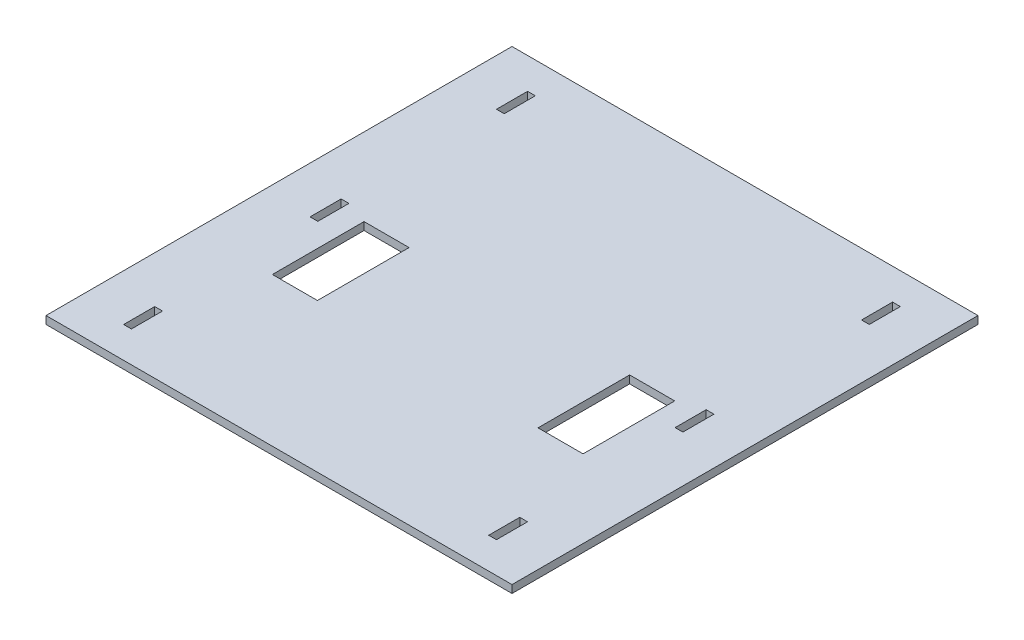
ISO-10303-21;
HEADER;
FILE_DESCRIPTION(('STEP AP214'),'2;1');
FILE_NAME('part.step','',(''),(''),'','','');
FILE_SCHEMA(('AUTOMOTIVE_DESIGN { 1 0 10303 214 1 1 1 1 }'));
ENDSEC;
DATA;
#1=APPLICATION_CONTEXT('core data for automotive mechanical design processes');
#2=APPLICATION_PROTOCOL_DEFINITION('international standard','automotive_design',2000,#1);
#3=PRODUCT_CONTEXT('',#1,'mechanical');
#4=PRODUCT('Part','Part','',(#3));
#5=PRODUCT_RELATED_PRODUCT_CATEGORY('part','',(#4));
#6=PRODUCT_DEFINITION_FORMATION('','',#4);
#7=PRODUCT_DEFINITION_CONTEXT('part definition',#1,'design');
#8=PRODUCT_DEFINITION('design','',#6,#7);
#9=PRODUCT_DEFINITION_SHAPE('','',#8);
#10=(LENGTH_UNIT() NAMED_UNIT(*) SI_UNIT(.MILLI.,.METRE.));
#11=(NAMED_UNIT(*) PLANE_ANGLE_UNIT() SI_UNIT($,.RADIAN.));
#12=(NAMED_UNIT(*) SI_UNIT($,.STERADIAN.) SOLID_ANGLE_UNIT());
#13=UNCERTAINTY_MEASURE_WITH_UNIT(LENGTH_MEASURE(1.E-05),#10,'distance_accuracy_value','');
#14=(GEOMETRIC_REPRESENTATION_CONTEXT(3) GLOBAL_UNCERTAINTY_ASSIGNED_CONTEXT((#13)) GLOBAL_UNIT_ASSIGNED_CONTEXT((#10,
#11,#12)) REPRESENTATION_CONTEXT('',''));
#15=CARTESIAN_POINT('',(0.,0.,0.));
#16=DIRECTION('',(0.,0.,1.));
#17=DIRECTION('',(1.,0.,0.));
#18=AXIS2_PLACEMENT_3D('',#15,#16,#17);
#19=CARTESIAN_POINT('',(0.,5.,0.));
#20=DIRECTION('',(1.,0.,0.));
#21=DIRECTION('',(0.,0.,-1.));
#22=AXIS2_PLACEMENT_3D('',#19,#20,#21);
#23=PLANE('',#22);
#24=DIRECTION('',(0.,0.,1.));
#25=VECTOR('',#24,1.);
#26=CARTESIAN_POINT('',(0.,0.,0.));
#27=LINE('',#26,#25);
#28=CARTESIAN_POINT('',(0.,0.,-300.));
#29=VERTEX_POINT('',#28);
#30=CARTESIAN_POINT('',(0.,0.,0.));
#31=VERTEX_POINT('',#30);
#32=EDGE_CURVE('E579',#29,#31,#27,.T.);
#33=ORIENTED_EDGE('',*,*,#32,.T.);
#34=DIRECTION('',(0.,-1.,0.));
#35=VECTOR('',#34,1.);
#36=CARTESIAN_POINT('',(0.,5.,0.));
#37=LINE('',#36,#35);
#38=CARTESIAN_POINT('',(0.,5.,0.));
#39=VERTEX_POINT('',#38);
#40=EDGE_CURVE('E11',#39,#31,#37,.T.);
#41=ORIENTED_EDGE('',*,*,#40,.F.);
#42=DIRECTION('',(0.,0.,1.));
#43=VECTOR('',#42,1.);
#44=CARTESIAN_POINT('',(0.,5.,0.));
#45=LINE('',#44,#43);
#46=CARTESIAN_POINT('',(0.,5.,-300.));
#47=VERTEX_POINT('',#46);
#48=EDGE_CURVE('E631',#47,#39,#45,.T.);
#49=ORIENTED_EDGE('',*,*,#48,.F.);
#50=DIRECTION('',(0.,-1.,0.));
#51=VECTOR('',#50,1.);
#52=CARTESIAN_POINT('',(0.,5.,-300.));
#53=LINE('',#52,#51);
#54=EDGE_CURVE('E645',#47,#29,#53,.T.);
#55=ORIENTED_EDGE('',*,*,#54,.T.);
#56=EDGE_LOOP('',(#33,#41,#49,#55));
#57=FACE_BOUND('',#56,.T.);
#58=ADVANCED_FACE('F38',(#57),#23,.F.);
#59=CARTESIAN_POINT('',(0.,5.,0.));
#60=DIRECTION('',(0.,0.,-1.));
#61=DIRECTION('',(-1.,0.,0.));
#62=AXIS2_PLACEMENT_3D('',#59,#60,#61);
#63=PLANE('',#62);
#64=DIRECTION('',(1.,0.,0.));
#65=VECTOR('',#64,1.);
#66=CARTESIAN_POINT('',(0.,0.,0.));
#67=LINE('',#66,#65);
#68=CARTESIAN_POINT('',(300.,0.,0.));
#69=VERTEX_POINT('',#68);
#70=EDGE_CURVE('E649',#31,#69,#67,.T.);
#71=ORIENTED_EDGE('',*,*,#70,.T.);
#72=DIRECTION('',(0.,-1.,0.));
#73=VECTOR('',#72,1.);
#74=CARTESIAN_POINT('',(300.,5.,0.));
#75=LINE('',#74,#73);
#76=CARTESIAN_POINT('',(300.,5.,0.));
#77=VERTEX_POINT('',#76);
#78=EDGE_CURVE('E46',#77,#69,#75,.T.);
#79=ORIENTED_EDGE('',*,*,#78,.F.);
#80=DIRECTION('',(1.,0.,0.));
#81=VECTOR('',#80,1.);
#82=CARTESIAN_POINT('',(0.,5.,0.));
#83=LINE('',#82,#81);
#84=EDGE_CURVE('E635',#39,#77,#83,.T.);
#85=ORIENTED_EDGE('',*,*,#84,.F.);
#86=ORIENTED_EDGE('',*,*,#40,.T.);
#87=EDGE_LOOP('',(#71,#79,#85,#86));
#88=FACE_BOUND('',#87,.T.);
#89=ADVANCED_FACE('F684',(#88),#63,.F.);
#90=CARTESIAN_POINT('',(300.,5.,0.));
#91=DIRECTION('',(-1.,0.,0.));
#92=DIRECTION('',(0.,0.,1.));
#93=AXIS2_PLACEMENT_3D('',#90,#91,#92);
#94=PLANE('',#93);
#95=DIRECTION('',(0.,0.,-1.));
#96=VECTOR('',#95,1.);
#97=CARTESIAN_POINT('',(300.,0.,0.));
#98=LINE('',#97,#96);
#99=CARTESIAN_POINT('',(300.,0.,-300.));
#100=VERTEX_POINT('',#99);
#101=EDGE_CURVE('E652',#69,#100,#98,.T.);
#102=ORIENTED_EDGE('',*,*,#101,.T.);
#103=DIRECTION('',(0.,-1.,0.));
#104=VECTOR('',#103,1.);
#105=CARTESIAN_POINT('',(300.,5.,-300.));
#106=LINE('',#105,#104);
#107=CARTESIAN_POINT('',(300.,5.,-300.));
#108=VERTEX_POINT('',#107);
#109=EDGE_CURVE('E660',#108,#100,#106,.T.);
#110=ORIENTED_EDGE('',*,*,#109,.F.);
#111=DIRECTION('',(0.,0.,-1.));
#112=VECTOR('',#111,1.);
#113=CARTESIAN_POINT('',(300.,5.,0.));
#114=LINE('',#113,#112);
#115=EDGE_CURVE('E639',#77,#108,#114,.T.);
#116=ORIENTED_EDGE('',*,*,#115,.F.);
#117=ORIENTED_EDGE('',*,*,#78,.T.);
#118=EDGE_LOOP('',(#102,#110,#116,#117));
#119=FACE_BOUND('',#118,.T.);
#120=ADVANCED_FACE('F669',(#119),#94,.F.);
#121=CARTESIAN_POINT('',(0.,5.,-300.));
#122=DIRECTION('',(0.,0.,1.));
#123=DIRECTION('',(1.,0.,0.));
#124=AXIS2_PLACEMENT_3D('',#121,#122,#123);
#125=PLANE('',#124);
#126=DIRECTION('',(-1.,0.,0.));
#127=VECTOR('',#126,1.);
#128=CARTESIAN_POINT('',(0.,0.,-300.));
#129=LINE('',#128,#127);
#130=EDGE_CURVE('E636',#100,#29,#129,.T.);
#131=ORIENTED_EDGE('',*,*,#130,.T.);
#132=ORIENTED_EDGE('',*,*,#54,.F.);
#133=DIRECTION('',(-1.,0.,0.));
#134=VECTOR('',#133,1.);
#135=CARTESIAN_POINT('',(0.,5.,-300.));
#136=LINE('',#135,#134);
#137=EDGE_CURVE('E642',#108,#47,#136,.T.);
#138=ORIENTED_EDGE('',*,*,#137,.F.);
#139=ORIENTED_EDGE('',*,*,#109,.T.);
#140=EDGE_LOOP('',(#131,#132,#138,#139));
#141=FACE_BOUND('',#140,.T.);
#142=ADVANCED_FACE('F677',(#141),#125,.F.);
#143=CARTESIAN_POINT('',(0.,5.,0.));
#144=DIRECTION('',(0.,-1.,0.));
#145=DIRECTION('',(0.,0.,-1.));
#146=AXIS2_PLACEMENT_3D('',#143,#144,#145);
#147=PLANE('',#146);
#148=DIRECTION('',(-1.,0.,0.));
#149=VECTOR('',#148,1.);
#150=CARTESIAN_POINT('',(270.,5.,-160.));
#151=LINE('',#150,#149);
#152=CARTESIAN_POINT('',(270.,5.,-160.));
#153=VERTEX_POINT('',#152);
#154=CARTESIAN_POINT('',(265.,5.,-160.));
#155=VERTEX_POINT('',#154);
#156=EDGE_CURVE('E347',#153,#155,#151,.T.);
#157=ORIENTED_EDGE('',*,*,#156,.F.);
#158=DIRECTION('',(0.,0.,-1.));
#159=VECTOR('',#158,1.);
#160=CARTESIAN_POINT('',(270.,5.,-140.));
#161=LINE('',#160,#159);
#162=CARTESIAN_POINT('',(270.,5.,-140.));
#163=VERTEX_POINT('',#162);
#164=EDGE_CURVE('E53',#163,#153,#161,.T.);
#165=ORIENTED_EDGE('',*,*,#164,.F.);
#166=DIRECTION('',(1.,0.,0.));
#167=VECTOR('',#166,1.);
#168=CARTESIAN_POINT('',(270.,5.,-140.));
#169=LINE('',#168,#167);
#170=CARTESIAN_POINT('',(265.,5.,-140.));
#171=VERTEX_POINT('',#170);
#172=EDGE_CURVE('E332',#171,#163,#169,.T.);
#173=ORIENTED_EDGE('',*,*,#172,.F.);
#174=DIRECTION('',(0.,0.,1.));
#175=VECTOR('',#174,1.);
#176=CARTESIAN_POINT('',(265.,5.,-140.));
#177=LINE('',#176,#175);
#178=EDGE_CURVE('E352',#155,#171,#177,.T.);
#179=ORIENTED_EDGE('',*,*,#178,.F.);
#180=EDGE_LOOP('',(#157,#165,#173,#179));
#181=FACE_BOUND('',#180,.T.);
#182=DIRECTION('',(-1.,0.,0.));
#183=VECTOR('',#182,1.);
#184=CARTESIAN_POINT('',(270.,5.,-280.));
#185=LINE('',#184,#183);
#186=CARTESIAN_POINT('',(270.,5.,-280.));
#187=VERTEX_POINT('',#186);
#188=CARTESIAN_POINT('',(265.,5.,-280.));
#189=VERTEX_POINT('',#188);
#190=EDGE_CURVE('E391',#187,#189,#185,.T.);
#191=ORIENTED_EDGE('',*,*,#190,.F.);
#192=DIRECTION('',(0.,0.,-1.));
#193=VECTOR('',#192,1.);
#194=CARTESIAN_POINT('',(270.,5.,-260.));
#195=LINE('',#194,#193);
#196=CARTESIAN_POINT('',(270.,5.,-260.));
#197=VERTEX_POINT('',#196);
#198=EDGE_CURVE('E61',#197,#187,#195,.T.);
#199=ORIENTED_EDGE('',*,*,#198,.F.);
#200=DIRECTION('',(1.,0.,0.));
#201=VECTOR('',#200,1.);
#202=CARTESIAN_POINT('',(270.,5.,-260.));
#203=LINE('',#202,#201);
#204=CARTESIAN_POINT('',(265.,5.,-260.));
#205=VERTEX_POINT('',#204);
#206=EDGE_CURVE('E376',#205,#197,#203,.T.);
#207=ORIENTED_EDGE('',*,*,#206,.F.);
#208=DIRECTION('',(0.,0.,1.));
#209=VECTOR('',#208,1.);
#210=CARTESIAN_POINT('',(265.,5.,-260.));
#211=LINE('',#210,#209);
#212=EDGE_CURVE('E396',#189,#205,#211,.T.);
#213=ORIENTED_EDGE('',*,*,#212,.F.);
#214=EDGE_LOOP('',(#191,#199,#207,#213));
#215=FACE_BOUND('',#214,.T.);
#216=DIRECTION('',(-1.,0.,0.));
#217=VECTOR('',#216,1.);
#218=CARTESIAN_POINT('',(35.,5.,-40.));
#219=LINE('',#218,#217);
#220=CARTESIAN_POINT('',(35.,5.,-40.));
#221=VERTEX_POINT('',#220);
#222=CARTESIAN_POINT('',(30.,5.,-40.));
#223=VERTEX_POINT('',#222);
#224=EDGE_CURVE('E434',#221,#223,#219,.T.);
#225=ORIENTED_EDGE('',*,*,#224,.F.);
#226=DIRECTION('',(0.,0.,-1.));
#227=VECTOR('',#226,1.);
#228=CARTESIAN_POINT('',(35.,5.,-20.));
#229=LINE('',#228,#227);
#230=CARTESIAN_POINT('',(35.,5.,-20.));
#231=VERTEX_POINT('',#230);
#232=EDGE_CURVE('E431',#231,#221,#229,.T.);
#233=ORIENTED_EDGE('',*,*,#232,.F.);
#234=DIRECTION('',(1.,0.,0.));
#235=VECTOR('',#234,1.);
#236=CARTESIAN_POINT('',(35.,5.,-20.));
#237=LINE('',#236,#235);
#238=CARTESIAN_POINT('',(30.,5.,-20.));
#239=VERTEX_POINT('',#238);
#240=EDGE_CURVE('E418',#239,#231,#237,.T.);
#241=ORIENTED_EDGE('',*,*,#240,.F.);
#242=DIRECTION('',(0.,0.,1.));
#243=VECTOR('',#242,1.);
#244=CARTESIAN_POINT('',(30.,5.,-20.));
#245=LINE('',#244,#243);
#246=EDGE_CURVE('E439',#223,#239,#245,.T.);
#247=ORIENTED_EDGE('',*,*,#246,.F.);
#248=EDGE_LOOP('',(#225,#233,#241,#247));
#249=FACE_BOUND('',#248,.T.);
#250=DIRECTION('',(-1.,0.,0.));
#251=VECTOR('',#250,1.);
#252=CARTESIAN_POINT('',(35.,5.,-160.));
#253=LINE('',#252,#251);
#254=CARTESIAN_POINT('',(35.,5.,-160.));
#255=VERTEX_POINT('',#254);
#256=CARTESIAN_POINT('',(30.,5.,-160.));
#257=VERTEX_POINT('',#256);
#258=EDGE_CURVE('E477',#255,#257,#253,.T.);
#259=ORIENTED_EDGE('',*,*,#258,.F.);
#260=DIRECTION('',(0.,0.,-1.));
#261=VECTOR('',#260,1.);
#262=CARTESIAN_POINT('',(35.,5.,-140.));
#263=LINE('',#262,#261);
#264=CARTESIAN_POINT('',(35.,5.,-140.));
#265=VERTEX_POINT('',#264);
#266=EDGE_CURVE('E321',#265,#255,#263,.T.);
#267=ORIENTED_EDGE('',*,*,#266,.F.);
#268=DIRECTION('',(1.,0.,0.));
#269=VECTOR('',#268,1.);
#270=CARTESIAN_POINT('',(35.,5.,-140.));
#271=LINE('',#270,#269);
#272=CARTESIAN_POINT('',(30.,5.,-140.));
#273=VERTEX_POINT('',#272);
#274=EDGE_CURVE('E462',#273,#265,#271,.T.);
#275=ORIENTED_EDGE('',*,*,#274,.F.);
#276=DIRECTION('',(0.,0.,1.));
#277=VECTOR('',#276,1.);
#278=CARTESIAN_POINT('',(30.,5.,-140.));
#279=LINE('',#278,#277);
#280=EDGE_CURVE('E481',#257,#273,#279,.T.);
#281=ORIENTED_EDGE('',*,*,#280,.F.);
#282=EDGE_LOOP('',(#259,#267,#275,#281));
#283=FACE_BOUND('',#282,.T.);
#284=DIRECTION('',(-1.,0.,0.));
#285=VECTOR('',#284,1.);
#286=CARTESIAN_POINT('',(35.,5.,-280.));
#287=LINE('',#286,#285);
#288=CARTESIAN_POINT('',(35.,5.,-280.));
#289=VERTEX_POINT('',#288);
#290=CARTESIAN_POINT('',(30.,5.,-280.));
#291=VERTEX_POINT('',#290);
#292=EDGE_CURVE('E312',#289,#291,#287,.T.);
#293=ORIENTED_EDGE('',*,*,#292,.F.);
#294=DIRECTION('',(0.,0.,-1.));
#295=VECTOR('',#294,1.);
#296=CARTESIAN_POINT('',(35.,5.,-260.));
#297=LINE('',#296,#295);
#298=CARTESIAN_POINT('',(35.,5.,-260.));
#299=VERTEX_POINT('',#298);
#300=EDGE_CURVE('E278',#299,#289,#297,.T.);
#301=ORIENTED_EDGE('',*,*,#300,.F.);
#302=DIRECTION('',(1.,0.,0.));
#303=VECTOR('',#302,1.);
#304=CARTESIAN_POINT('',(35.,5.,-260.));
#305=LINE('',#304,#303);
#306=CARTESIAN_POINT('',(30.,5.,-260.));
#307=VERTEX_POINT('',#306);
#308=EDGE_CURVE('E299',#307,#299,#305,.T.);
#309=ORIENTED_EDGE('',*,*,#308,.F.);
#310=DIRECTION('',(0.,0.,1.));
#311=VECTOR('',#310,1.);
#312=CARTESIAN_POINT('',(30.,5.,-260.));
#313=LINE('',#312,#311);
#314=EDGE_CURVE('E303',#291,#307,#313,.T.);
#315=ORIENTED_EDGE('',*,*,#314,.F.);
#316=EDGE_LOOP('',(#293,#301,#309,#315));
#317=FACE_BOUND('',#316,.T.);
#318=DIRECTION('',(-1.,0.,0.));
#319=VECTOR('',#318,1.);
#320=CARTESIAN_POINT('',(270.,5.,-40.));
#321=LINE('',#320,#319);
#322=CARTESIAN_POINT('',(270.,5.,-40.));
#323=VERTEX_POINT('',#322);
#324=CARTESIAN_POINT('',(265.,5.,-40.));
#325=VERTEX_POINT('',#324);
#326=EDGE_CURVE('E519',#323,#325,#321,.T.);
#327=ORIENTED_EDGE('',*,*,#326,.F.);
#328=DIRECTION('',(0.,0.,-1.));
#329=VECTOR('',#328,1.);
#330=CARTESIAN_POINT('',(270.,5.,-20.));
#331=LINE('',#330,#329);
#332=CARTESIAN_POINT('',(270.,5.,-20.));
#333=VERTEX_POINT('',#332);
#334=EDGE_CURVE('E362',#333,#323,#331,.T.);
#335=ORIENTED_EDGE('',*,*,#334,.F.);
#336=DIRECTION('',(1.,0.,0.));
#337=VECTOR('',#336,1.);
#338=CARTESIAN_POINT('',(270.,5.,-20.));
#339=LINE('',#338,#337);
#340=CARTESIAN_POINT('',(265.,5.,-20.));
#341=VERTEX_POINT('',#340);
#342=EDGE_CURVE('E504',#341,#333,#339,.T.);
#343=ORIENTED_EDGE('',*,*,#342,.F.);
#344=DIRECTION('',(0.,0.,1.));
#345=VECTOR('',#344,1.);
#346=CARTESIAN_POINT('',(265.,5.,-20.));
#347=LINE('',#346,#345);
#348=EDGE_CURVE('E523',#325,#341,#347,.T.);
#349=ORIENTED_EDGE('',*,*,#348,.F.);
#350=EDGE_LOOP('',(#327,#335,#343,#349));
#351=FACE_BOUND('',#350,.T.);
#352=DIRECTION('',(-1.,0.,0.));
#353=VECTOR('',#352,1.);
#354=CARTESIAN_POINT('',(250.,5.,-154.75));
#355=LINE('',#354,#353);
#356=CARTESIAN_POINT('',(250.,5.,-154.75));
#357=VERTEX_POINT('',#356);
#358=CARTESIAN_POINT('',(221.,5.,-154.75));
#359=VERTEX_POINT('',#358);
#360=EDGE_CURVE('E564',#357,#359,#355,.T.);
#361=ORIENTED_EDGE('',*,*,#360,.F.);
#362=DIRECTION('',(0.,0.,-1.));
#363=VECTOR('',#362,1.);
#364=CARTESIAN_POINT('',(250.,5.,-95.7499999999999));
#365=LINE('',#364,#363);
#366=CARTESIAN_POINT('',(250.,5.,-95.7499999999999));
#367=VERTEX_POINT('',#366);
#368=EDGE_CURVE('E561',#367,#357,#365,.T.);
#369=ORIENTED_EDGE('',*,*,#368,.F.);
#370=DIRECTION('',(1.,0.,0.));
#371=VECTOR('',#370,1.);
#372=CARTESIAN_POINT('',(250.,5.,-95.7499999999999));
#373=LINE('',#372,#371);
#374=CARTESIAN_POINT('',(221.,5.,-95.7499999999999));
#375=VERTEX_POINT('',#374);
#376=EDGE_CURVE('E548',#375,#367,#373,.T.);
#377=ORIENTED_EDGE('',*,*,#376,.F.);
#378=DIRECTION('',(0.,0.,1.));
#379=VECTOR('',#378,1.);
#380=CARTESIAN_POINT('',(221.,5.,-95.7499999999999));
#381=LINE('',#380,#379);
#382=EDGE_CURVE('E569',#359,#375,#381,.T.);
#383=ORIENTED_EDGE('',*,*,#382,.F.);
#384=EDGE_LOOP('',(#361,#369,#377,#383));
#385=FACE_BOUND('',#384,.T.);
#386=DIRECTION('',(-1.,0.,0.));
#387=VECTOR('',#386,1.);
#388=CARTESIAN_POINT('',(79.,5.,-154.75));
#389=LINE('',#388,#387);
#390=CARTESIAN_POINT('',(79.,5.,-154.75));
#391=VERTEX_POINT('',#390);
#392=CARTESIAN_POINT('',(50.,5.,-154.75));
#393=VERTEX_POINT('',#392);
#394=EDGE_CURVE('E609',#391,#393,#389,.T.);
#395=ORIENTED_EDGE('',*,*,#394,.F.);
#396=DIRECTION('',(0.,0.,-1.));
#397=VECTOR('',#396,1.);
#398=CARTESIAN_POINT('',(79.,5.,-95.7499999999999));
#399=LINE('',#398,#397);
#400=CARTESIAN_POINT('',(79.,5.,-95.7499999999999));
#401=VERTEX_POINT('',#400);
#402=EDGE_CURVE('E533',#401,#391,#399,.T.);
#403=ORIENTED_EDGE('',*,*,#402,.F.);
#404=DIRECTION('',(1.,0.,0.));
#405=VECTOR('',#404,1.);
#406=CARTESIAN_POINT('',(79.,5.,-95.7499999999999));
#407=LINE('',#406,#405);
#408=CARTESIAN_POINT('',(50.,5.,-95.7499999999999));
#409=VERTEX_POINT('',#408);
#410=EDGE_CURVE('E594',#409,#401,#407,.T.);
#411=ORIENTED_EDGE('',*,*,#410,.F.);
#412=DIRECTION('',(0.,0.,1.));
#413=VECTOR('',#412,1.);
#414=CARTESIAN_POINT('',(50.,5.,-95.7499999999999));
#415=LINE('',#414,#413);
#416=EDGE_CURVE('E613',#393,#409,#415,.T.);
#417=ORIENTED_EDGE('',*,*,#416,.F.);
#418=EDGE_LOOP('',(#395,#403,#411,#417));
#419=FACE_BOUND('',#418,.T.);
#420=ORIENTED_EDGE('',*,*,#48,.T.);
#421=ORIENTED_EDGE('',*,*,#84,.T.);
#422=ORIENTED_EDGE('',*,*,#115,.T.);
#423=ORIENTED_EDGE('',*,*,#137,.T.);
#424=EDGE_LOOP('',(#420,#421,#422,#423));
#425=FACE_BOUND('',#424,.T.);
#426=ADVANCED_FACE('F683',(#181,#215,#249,#283,#317,#351,#385,#419,#425),#147,.F.);
#427=CARTESIAN_POINT('',(0.,0.,0.));
#428=DIRECTION('',(0.,-1.,0.));
#429=DIRECTION('',(0.,0.,-1.));
#430=AXIS2_PLACEMENT_3D('',#427,#428,#429);
#431=PLANE('',#430);
#432=DIRECTION('',(0.,0.,-1.));
#433=VECTOR('',#432,1.);
#434=CARTESIAN_POINT('',(270.,0.,-140.));
#435=LINE('',#434,#433);
#436=CARTESIAN_POINT('',(270.,0.,-140.));
#437=VERTEX_POINT('',#436);
#438=CARTESIAN_POINT('',(270.,0.,-160.));
#439=VERTEX_POINT('',#438);
#440=EDGE_CURVE('E327',#437,#439,#435,.T.);
#441=ORIENTED_EDGE('',*,*,#440,.T.);
#442=DIRECTION('',(-1.,0.,0.));
#443=VECTOR('',#442,1.);
#444=CARTESIAN_POINT('',(270.,0.,-160.));
#445=LINE('',#444,#443);
#446=CARTESIAN_POINT('',(265.,0.,-160.));
#447=VERTEX_POINT('',#446);
#448=EDGE_CURVE('E331',#439,#447,#445,.T.);
#449=ORIENTED_EDGE('',*,*,#448,.T.);
#450=DIRECTION('',(0.,0.,1.));
#451=VECTOR('',#450,1.);
#452=CARTESIAN_POINT('',(265.,0.,-140.));
#453=LINE('',#452,#451);
#454=CARTESIAN_POINT('',(265.,0.,-140.));
#455=VERTEX_POINT('',#454);
#456=EDGE_CURVE('E336',#447,#455,#453,.T.);
#457=ORIENTED_EDGE('',*,*,#456,.T.);
#458=DIRECTION('',(1.,0.,0.));
#459=VECTOR('',#458,1.);
#460=CARTESIAN_POINT('',(270.,0.,-140.));
#461=LINE('',#460,#459);
#462=EDGE_CURVE('E340',#455,#437,#461,.T.);
#463=ORIENTED_EDGE('',*,*,#462,.T.);
#464=EDGE_LOOP('',(#441,#449,#457,#463));
#465=FACE_BOUND('',#464,.T.);
#466=DIRECTION('',(0.,0.,-1.));
#467=VECTOR('',#466,1.);
#468=CARTESIAN_POINT('',(270.,0.,-260.));
#469=LINE('',#468,#467);
#470=CARTESIAN_POINT('',(270.,0.,-260.));
#471=VERTEX_POINT('',#470);
#472=CARTESIAN_POINT('',(270.,0.,-280.));
#473=VERTEX_POINT('',#472);
#474=EDGE_CURVE('E371',#471,#473,#469,.T.);
#475=ORIENTED_EDGE('',*,*,#474,.T.);
#476=DIRECTION('',(-1.,0.,0.));
#477=VECTOR('',#476,1.);
#478=CARTESIAN_POINT('',(270.,0.,-280.));
#479=LINE('',#478,#477);
#480=CARTESIAN_POINT('',(265.,0.,-280.));
#481=VERTEX_POINT('',#480);
#482=EDGE_CURVE('E375',#473,#481,#479,.T.);
#483=ORIENTED_EDGE('',*,*,#482,.T.);
#484=DIRECTION('',(0.,0.,1.));
#485=VECTOR('',#484,1.);
#486=CARTESIAN_POINT('',(265.,0.,-260.));
#487=LINE('',#486,#485);
#488=CARTESIAN_POINT('',(265.,0.,-260.));
#489=VERTEX_POINT('',#488);
#490=EDGE_CURVE('E380',#481,#489,#487,.T.);
#491=ORIENTED_EDGE('',*,*,#490,.T.);
#492=DIRECTION('',(1.,0.,0.));
#493=VECTOR('',#492,1.);
#494=CARTESIAN_POINT('',(270.,0.,-260.));
#495=LINE('',#494,#493);
#496=EDGE_CURVE('E384',#489,#471,#495,.T.);
#497=ORIENTED_EDGE('',*,*,#496,.T.);
#498=EDGE_LOOP('',(#475,#483,#491,#497));
#499=FACE_BOUND('',#498,.T.);
#500=DIRECTION('',(0.,0.,-1.));
#501=VECTOR('',#500,1.);
#502=CARTESIAN_POINT('',(35.,0.,-20.));
#503=LINE('',#502,#501);
#504=CARTESIAN_POINT('',(35.,0.,-20.));
#505=VERTEX_POINT('',#504);
#506=CARTESIAN_POINT('',(35.,0.,-40.));
#507=VERTEX_POINT('',#506);
#508=EDGE_CURVE('E413',#505,#507,#503,.T.);
#509=ORIENTED_EDGE('',*,*,#508,.T.);
#510=DIRECTION('',(-1.,0.,0.));
#511=VECTOR('',#510,1.);
#512=CARTESIAN_POINT('',(35.,0.,-40.));
#513=LINE('',#512,#511);
#514=CARTESIAN_POINT('',(30.,0.,-40.));
#515=VERTEX_POINT('',#514);
#516=EDGE_CURVE('E417',#507,#515,#513,.T.);
#517=ORIENTED_EDGE('',*,*,#516,.T.);
#518=DIRECTION('',(0.,0.,1.));
#519=VECTOR('',#518,1.);
#520=CARTESIAN_POINT('',(30.,0.,-20.));
#521=LINE('',#520,#519);
#522=CARTESIAN_POINT('',(30.,0.,-20.));
#523=VERTEX_POINT('',#522);
#524=EDGE_CURVE('E422',#515,#523,#521,.T.);
#525=ORIENTED_EDGE('',*,*,#524,.T.);
#526=DIRECTION('',(1.,0.,0.));
#527=VECTOR('',#526,1.);
#528=CARTESIAN_POINT('',(35.,0.,-20.));
#529=LINE('',#528,#527);
#530=EDGE_CURVE('E426',#523,#505,#529,.T.);
#531=ORIENTED_EDGE('',*,*,#530,.T.);
#532=EDGE_LOOP('',(#509,#517,#525,#531));
#533=FACE_BOUND('',#532,.T.);
#534=DIRECTION('',(0.,0.,-1.));
#535=VECTOR('',#534,1.);
#536=CARTESIAN_POINT('',(35.,0.,-140.));
#537=LINE('',#536,#535);
#538=CARTESIAN_POINT('',(35.,0.,-140.));
#539=VERTEX_POINT('',#538);
#540=CARTESIAN_POINT('',(35.,0.,-160.));
#541=VERTEX_POINT('',#540);
#542=EDGE_CURVE('E457',#539,#541,#537,.T.);
#543=ORIENTED_EDGE('',*,*,#542,.T.);
#544=DIRECTION('',(-1.,0.,0.));
#545=VECTOR('',#544,1.);
#546=CARTESIAN_POINT('',(35.,0.,-160.));
#547=LINE('',#546,#545);
#548=CARTESIAN_POINT('',(30.,0.,-160.));
#549=VERTEX_POINT('',#548);
#550=EDGE_CURVE('E461',#541,#549,#547,.T.);
#551=ORIENTED_EDGE('',*,*,#550,.T.);
#552=DIRECTION('',(0.,0.,1.));
#553=VECTOR('',#552,1.);
#554=CARTESIAN_POINT('',(30.,0.,-140.));
#555=LINE('',#554,#553);
#556=CARTESIAN_POINT('',(30.,0.,-140.));
#557=VERTEX_POINT('',#556);
#558=EDGE_CURVE('E466',#549,#557,#555,.T.);
#559=ORIENTED_EDGE('',*,*,#558,.T.);
#560=DIRECTION('',(1.,0.,0.));
#561=VECTOR('',#560,1.);
#562=CARTESIAN_POINT('',(35.,0.,-140.));
#563=LINE('',#562,#561);
#564=EDGE_CURVE('E470',#557,#539,#563,.T.);
#565=ORIENTED_EDGE('',*,*,#564,.T.);
#566=EDGE_LOOP('',(#543,#551,#559,#565));
#567=FACE_BOUND('',#566,.T.);
#568=DIRECTION('',(0.,0.,-1.));
#569=VECTOR('',#568,1.);
#570=CARTESIAN_POINT('',(35.,0.,-260.));
#571=LINE('',#570,#569);
#572=CARTESIAN_POINT('',(35.,0.,-260.));
#573=VERTEX_POINT('',#572);
#574=CARTESIAN_POINT('',(35.,0.,-280.));
#575=VERTEX_POINT('',#574);
#576=EDGE_CURVE('E275',#573,#575,#571,.T.);
#577=ORIENTED_EDGE('',*,*,#576,.T.);
#578=DIRECTION('',(-1.,0.,0.));
#579=VECTOR('',#578,1.);
#580=CARTESIAN_POINT('',(35.,0.,-280.));
#581=LINE('',#580,#579);
#582=CARTESIAN_POINT('',(30.,0.,-280.));
#583=VERTEX_POINT('',#582);
#584=EDGE_CURVE('E288',#575,#583,#581,.T.);
#585=ORIENTED_EDGE('',*,*,#584,.T.);
#586=DIRECTION('',(0.,0.,1.));
#587=VECTOR('',#586,1.);
#588=CARTESIAN_POINT('',(30.,0.,-260.));
#589=LINE('',#588,#587);
#590=CARTESIAN_POINT('',(30.,0.,-260.));
#591=VERTEX_POINT('',#590);
#592=EDGE_CURVE('E293',#583,#591,#589,.T.);
#593=ORIENTED_EDGE('',*,*,#592,.T.);
#594=DIRECTION('',(1.,0.,0.));
#595=VECTOR('',#594,1.);
#596=CARTESIAN_POINT('',(35.,0.,-260.));
#597=LINE('',#596,#595);
#598=EDGE_CURVE('E284',#591,#573,#597,.T.);
#599=ORIENTED_EDGE('',*,*,#598,.T.);
#600=EDGE_LOOP('',(#577,#585,#593,#599));
#601=FACE_BOUND('',#600,.T.);
#602=DIRECTION('',(0.,0.,-1.));
#603=VECTOR('',#602,1.);
#604=CARTESIAN_POINT('',(270.,0.,-20.));
#605=LINE('',#604,#603);
#606=CARTESIAN_POINT('',(270.,0.,-20.));
#607=VERTEX_POINT('',#606);
#608=CARTESIAN_POINT('',(270.,0.,-40.));
#609=VERTEX_POINT('',#608);
#610=EDGE_CURVE('E499',#607,#609,#605,.T.);
#611=ORIENTED_EDGE('',*,*,#610,.T.);
#612=DIRECTION('',(-1.,0.,0.));
#613=VECTOR('',#612,1.);
#614=CARTESIAN_POINT('',(270.,0.,-40.));
#615=LINE('',#614,#613);
#616=CARTESIAN_POINT('',(265.,0.,-40.));
#617=VERTEX_POINT('',#616);
#618=EDGE_CURVE('E503',#609,#617,#615,.T.);
#619=ORIENTED_EDGE('',*,*,#618,.T.);
#620=DIRECTION('',(0.,0.,1.));
#621=VECTOR('',#620,1.);
#622=CARTESIAN_POINT('',(265.,0.,-20.));
#623=LINE('',#622,#621);
#624=CARTESIAN_POINT('',(265.,0.,-20.));
#625=VERTEX_POINT('',#624);
#626=EDGE_CURVE('E508',#617,#625,#623,.T.);
#627=ORIENTED_EDGE('',*,*,#626,.T.);
#628=DIRECTION('',(1.,0.,0.));
#629=VECTOR('',#628,1.);
#630=CARTESIAN_POINT('',(270.,0.,-20.));
#631=LINE('',#630,#629);
#632=EDGE_CURVE('E512',#625,#607,#631,.T.);
#633=ORIENTED_EDGE('',*,*,#632,.T.);
#634=EDGE_LOOP('',(#611,#619,#627,#633));
#635=FACE_BOUND('',#634,.T.);
#636=DIRECTION('',(0.,0.,-1.));
#637=VECTOR('',#636,1.);
#638=CARTESIAN_POINT('',(250.,0.,-95.7499999999999));
#639=LINE('',#638,#637);
#640=CARTESIAN_POINT('',(250.,0.,-95.7499999999999));
#641=VERTEX_POINT('',#640);
#642=CARTESIAN_POINT('',(250.,0.,-154.75));
#643=VERTEX_POINT('',#642);
#644=EDGE_CURVE('E543',#641,#643,#639,.T.);
#645=ORIENTED_EDGE('',*,*,#644,.T.);
#646=DIRECTION('',(-1.,0.,0.));
#647=VECTOR('',#646,1.);
#648=CARTESIAN_POINT('',(250.,0.,-154.75));
#649=LINE('',#648,#647);
#650=CARTESIAN_POINT('',(221.,0.,-154.75));
#651=VERTEX_POINT('',#650);
#652=EDGE_CURVE('E547',#643,#651,#649,.T.);
#653=ORIENTED_EDGE('',*,*,#652,.T.);
#654=DIRECTION('',(0.,0.,1.));
#655=VECTOR('',#654,1.);
#656=CARTESIAN_POINT('',(221.,0.,-95.7499999999999));
#657=LINE('',#656,#655);
#658=CARTESIAN_POINT('',(221.,0.,-95.7499999999999));
#659=VERTEX_POINT('',#658);
#660=EDGE_CURVE('E552',#651,#659,#657,.T.);
#661=ORIENTED_EDGE('',*,*,#660,.T.);
#662=DIRECTION('',(1.,0.,0.));
#663=VECTOR('',#662,1.);
#664=CARTESIAN_POINT('',(250.,0.,-95.7499999999999));
#665=LINE('',#664,#663);
#666=EDGE_CURVE('E556',#659,#641,#665,.T.);
#667=ORIENTED_EDGE('',*,*,#666,.T.);
#668=EDGE_LOOP('',(#645,#653,#661,#667));
#669=FACE_BOUND('',#668,.T.);
#670=DIRECTION('',(0.,0.,-1.));
#671=VECTOR('',#670,1.);
#672=CARTESIAN_POINT('',(79.,0.,-95.7499999999999));
#673=LINE('',#672,#671);
#674=CARTESIAN_POINT('',(79.,0.,-95.7499999999999));
#675=VERTEX_POINT('',#674);
#676=CARTESIAN_POINT('',(79.,0.,-154.75));
#677=VERTEX_POINT('',#676);
#678=EDGE_CURVE('E589',#675,#677,#673,.T.);
#679=ORIENTED_EDGE('',*,*,#678,.T.);
#680=DIRECTION('',(-1.,0.,0.));
#681=VECTOR('',#680,1.);
#682=CARTESIAN_POINT('',(79.,0.,-154.75));
#683=LINE('',#682,#681);
#684=CARTESIAN_POINT('',(50.,0.,-154.75));
#685=VERTEX_POINT('',#684);
#686=EDGE_CURVE('E593',#677,#685,#683,.T.);
#687=ORIENTED_EDGE('',*,*,#686,.T.);
#688=DIRECTION('',(0.,0.,1.));
#689=VECTOR('',#688,1.);
#690=CARTESIAN_POINT('',(50.,0.,-95.7499999999999));
#691=LINE('',#690,#689);
#692=CARTESIAN_POINT('',(50.,0.,-95.7499999999999));
#693=VERTEX_POINT('',#692);
#694=EDGE_CURVE('E598',#685,#693,#691,.T.);
#695=ORIENTED_EDGE('',*,*,#694,.T.);
#696=DIRECTION('',(1.,0.,0.));
#697=VECTOR('',#696,1.);
#698=CARTESIAN_POINT('',(79.,0.,-95.7499999999999));
#699=LINE('',#698,#697);
#700=EDGE_CURVE('E602',#693,#675,#699,.T.);
#701=ORIENTED_EDGE('',*,*,#700,.T.);
#702=EDGE_LOOP('',(#679,#687,#695,#701));
#703=FACE_BOUND('',#702,.T.);
#704=ORIENTED_EDGE('',*,*,#32,.F.);
#705=ORIENTED_EDGE('',*,*,#130,.F.);
#706=ORIENTED_EDGE('',*,*,#101,.F.);
#707=ORIENTED_EDGE('',*,*,#70,.F.);
#708=EDGE_LOOP('',(#704,#705,#706,#707));
#709=FACE_BOUND('',#708,.T.);
#710=ADVANCED_FACE('F295',(#465,#499,#533,#567,#601,#635,#669,#703,#709),#431,.T.);
#711=CARTESIAN_POINT('',(79.,0.,-95.7499999999999));
#712=DIRECTION('',(1.,0.,0.));
#713=DIRECTION('',(0.,0.,-1.));
#714=AXIS2_PLACEMENT_3D('',#711,#712,#713);
#715=PLANE('',#714);
#716=ORIENTED_EDGE('',*,*,#402,.T.);
#717=DIRECTION('',(0.,1.,0.));
#718=VECTOR('',#717,1.);
#719=CARTESIAN_POINT('',(79.,0.,-154.75));
#720=LINE('',#719,#718);
#721=EDGE_CURVE('E606',#677,#391,#720,.T.);
#722=ORIENTED_EDGE('',*,*,#721,.F.);
#723=ORIENTED_EDGE('',*,*,#678,.F.);
#724=DIRECTION('',(0.,1.,0.));
#725=VECTOR('',#724,1.);
#726=CARTESIAN_POINT('',(79.,0.,-95.7499999999999));
#727=LINE('',#726,#725);
#728=EDGE_CURVE('E565',#675,#401,#727,.T.);
#729=ORIENTED_EDGE('',*,*,#728,.T.);
#730=EDGE_LOOP('',(#716,#722,#723,#729));
#731=FACE_BOUND('',#730,.T.);
#732=ADVANCED_FACE('F696',(#731),#715,.F.);
#733=CARTESIAN_POINT('',(79.,0.,-95.7499999999999));
#734=DIRECTION('',(0.,0.,1.));
#735=DIRECTION('',(1.,0.,0.));
#736=AXIS2_PLACEMENT_3D('',#733,#734,#735);
#737=PLANE('',#736);
#738=ORIENTED_EDGE('',*,*,#410,.T.);
#739=ORIENTED_EDGE('',*,*,#728,.F.);
#740=ORIENTED_EDGE('',*,*,#700,.F.);
#741=DIRECTION('',(0.,1.,0.));
#742=VECTOR('',#741,1.);
#743=CARTESIAN_POINT('',(50.,0.,-95.7499999999999));
#744=LINE('',#743,#742);
#745=EDGE_CURVE('E622',#693,#409,#744,.T.);
#746=ORIENTED_EDGE('',*,*,#745,.T.);
#747=EDGE_LOOP('',(#738,#739,#740,#746));
#748=FACE_BOUND('',#747,.T.);
#749=ADVANCED_FACE('F703',(#748),#737,.F.);
#750=CARTESIAN_POINT('',(50.,0.,-95.7499999999999));
#751=DIRECTION('',(-1.,0.,0.));
#752=DIRECTION('',(0.,0.,1.));
#753=AXIS2_PLACEMENT_3D('',#750,#751,#752);
#754=PLANE('',#753);
#755=ORIENTED_EDGE('',*,*,#416,.T.);
#756=ORIENTED_EDGE('',*,*,#745,.F.);
#757=ORIENTED_EDGE('',*,*,#694,.F.);
#758=DIRECTION('',(0.,1.,0.));
#759=VECTOR('',#758,1.);
#760=CARTESIAN_POINT('',(50.,0.,-154.75));
#761=LINE('',#760,#759);
#762=EDGE_CURVE('E625',#685,#393,#761,.T.);
#763=ORIENTED_EDGE('',*,*,#762,.T.);
#764=EDGE_LOOP('',(#755,#756,#757,#763));
#765=FACE_BOUND('',#764,.T.);
#766=ADVANCED_FACE('F709',(#765),#754,.F.);
#767=CARTESIAN_POINT('',(79.,0.,-154.75));
#768=DIRECTION('',(0.,0.,-1.));
#769=DIRECTION('',(-1.,0.,0.));
#770=AXIS2_PLACEMENT_3D('',#767,#768,#769);
#771=PLANE('',#770);
#772=ORIENTED_EDGE('',*,*,#394,.T.);
#773=ORIENTED_EDGE('',*,*,#762,.F.);
#774=ORIENTED_EDGE('',*,*,#686,.F.);
#775=ORIENTED_EDGE('',*,*,#721,.T.);
#776=EDGE_LOOP('',(#772,#773,#774,#775));
#777=FACE_BOUND('',#776,.T.);
#778=ADVANCED_FACE('F705',(#777),#771,.F.);
#779=CARTESIAN_POINT('',(250.,0.,-95.7499999999999));
#780=DIRECTION('',(1.,0.,0.));
#781=DIRECTION('',(0.,0.,-1.));
#782=AXIS2_PLACEMENT_3D('',#779,#780,#781);
#783=PLANE('',#782);
#784=ORIENTED_EDGE('',*,*,#368,.T.);
#785=DIRECTION('',(0.,1.,0.));
#786=VECTOR('',#785,1.);
#787=CARTESIAN_POINT('',(250.,0.,-154.75));
#788=LINE('',#787,#786);
#789=EDGE_CURVE('E560',#643,#357,#788,.T.);
#790=ORIENTED_EDGE('',*,*,#789,.F.);
#791=ORIENTED_EDGE('',*,*,#644,.F.);
#792=DIRECTION('',(0.,1.,0.));
#793=VECTOR('',#792,1.);
#794=CARTESIAN_POINT('',(250.,0.,-95.7499999999999));
#795=LINE('',#794,#793);
#796=EDGE_CURVE('E576',#641,#367,#795,.T.);
#797=ORIENTED_EDGE('',*,*,#796,.T.);
#798=EDGE_LOOP('',(#784,#790,#791,#797));
#799=FACE_BOUND('',#798,.T.);
#800=ADVANCED_FACE('F708',(#799),#783,.F.);
#801=CARTESIAN_POINT('',(250.,0.,-95.7499999999999));
#802=DIRECTION('',(0.,0.,1.));
#803=DIRECTION('',(1.,0.,0.));
#804=AXIS2_PLACEMENT_3D('',#801,#802,#803);
#805=PLANE('',#804);
#806=ORIENTED_EDGE('',*,*,#376,.T.);
#807=ORIENTED_EDGE('',*,*,#796,.F.);
#808=ORIENTED_EDGE('',*,*,#666,.F.);
#809=DIRECTION('',(0.,1.,0.));
#810=VECTOR('',#809,1.);
#811=CARTESIAN_POINT('',(221.,0.,-95.7499999999999));
#812=LINE('',#811,#810);
#813=EDGE_CURVE('E580',#659,#375,#812,.T.);
#814=ORIENTED_EDGE('',*,*,#813,.T.);
#815=EDGE_LOOP('',(#806,#807,#808,#814));
#816=FACE_BOUND('',#815,.T.);
#817=ADVANCED_FACE('F719',(#816),#805,.F.);
#818=CARTESIAN_POINT('',(221.,0.,-95.7499999999999));
#819=DIRECTION('',(-1.,0.,0.));
#820=DIRECTION('',(0.,0.,1.));
#821=AXIS2_PLACEMENT_3D('',#818,#819,#820);
#822=PLANE('',#821);
#823=ORIENTED_EDGE('',*,*,#382,.T.);
#824=ORIENTED_EDGE('',*,*,#813,.F.);
#825=ORIENTED_EDGE('',*,*,#660,.F.);
#826=DIRECTION('',(0.,1.,0.));
#827=VECTOR('',#826,1.);
#828=CARTESIAN_POINT('',(221.,0.,-154.75));
#829=LINE('',#828,#827);
#830=EDGE_CURVE('E583',#651,#359,#829,.T.);
#831=ORIENTED_EDGE('',*,*,#830,.T.);
#832=EDGE_LOOP('',(#823,#824,#825,#831));
#833=FACE_BOUND('',#832,.T.);
#834=ADVANCED_FACE('F725',(#833),#822,.F.);
#835=CARTESIAN_POINT('',(250.,0.,-154.75));
#836=DIRECTION('',(0.,0.,-1.));
#837=DIRECTION('',(-1.,0.,0.));
#838=AXIS2_PLACEMENT_3D('',#835,#836,#837);
#839=PLANE('',#838);
#840=ORIENTED_EDGE('',*,*,#360,.T.);
#841=ORIENTED_EDGE('',*,*,#830,.F.);
#842=ORIENTED_EDGE('',*,*,#652,.F.);
#843=ORIENTED_EDGE('',*,*,#789,.T.);
#844=EDGE_LOOP('',(#840,#841,#842,#843));
#845=FACE_BOUND('',#844,.T.);
#846=ADVANCED_FACE('F721',(#845),#839,.F.);
#847=CARTESIAN_POINT('',(270.,0.,-20.));
#848=DIRECTION('',(1.,0.,0.));
#849=DIRECTION('',(0.,0.,-1.));
#850=AXIS2_PLACEMENT_3D('',#847,#848,#849);
#851=PLANE('',#850);
#852=ORIENTED_EDGE('',*,*,#334,.T.);
#853=DIRECTION('',(0.,1.,0.));
#854=VECTOR('',#853,1.);
#855=CARTESIAN_POINT('',(270.,0.,-40.));
#856=LINE('',#855,#854);
#857=EDGE_CURVE('E516',#609,#323,#856,.T.);
#858=ORIENTED_EDGE('',*,*,#857,.F.);
#859=ORIENTED_EDGE('',*,*,#610,.F.);
#860=DIRECTION('',(0.,1.,0.));
#861=VECTOR('',#860,1.);
#862=CARTESIAN_POINT('',(270.,0.,-20.));
#863=LINE('',#862,#861);
#864=EDGE_CURVE('E530',#607,#333,#863,.T.);
#865=ORIENTED_EDGE('',*,*,#864,.T.);
#866=EDGE_LOOP('',(#852,#858,#859,#865));
#867=FACE_BOUND('',#866,.T.);
#868=ADVANCED_FACE('F724',(#867),#851,.F.);
#869=CARTESIAN_POINT('',(270.,0.,-20.));
#870=DIRECTION('',(0.,0.,1.));
#871=DIRECTION('',(1.,0.,0.));
#872=AXIS2_PLACEMENT_3D('',#869,#870,#871);
#873=PLANE('',#872);
#874=ORIENTED_EDGE('',*,*,#342,.T.);
#875=ORIENTED_EDGE('',*,*,#864,.F.);
#876=ORIENTED_EDGE('',*,*,#632,.F.);
#877=DIRECTION('',(0.,1.,0.));
#878=VECTOR('',#877,1.);
#879=CARTESIAN_POINT('',(265.,0.,-20.));
#880=LINE('',#879,#878);
#881=EDGE_CURVE('E534',#625,#341,#880,.T.);
#882=ORIENTED_EDGE('',*,*,#881,.T.);
#883=EDGE_LOOP('',(#874,#875,#876,#882));
#884=FACE_BOUND('',#883,.T.);
#885=ADVANCED_FACE('F735',(#884),#873,.F.);
#886=CARTESIAN_POINT('',(265.,0.,-20.));
#887=DIRECTION('',(-1.,0.,0.));
#888=DIRECTION('',(0.,0.,1.));
#889=AXIS2_PLACEMENT_3D('',#886,#887,#888);
#890=PLANE('',#889);
#891=ORIENTED_EDGE('',*,*,#348,.T.);
#892=ORIENTED_EDGE('',*,*,#881,.F.);
#893=ORIENTED_EDGE('',*,*,#626,.F.);
#894=DIRECTION('',(0.,1.,0.));
#895=VECTOR('',#894,1.);
#896=CARTESIAN_POINT('',(265.,0.,-40.));
#897=LINE('',#896,#895);
#898=EDGE_CURVE('E537',#617,#325,#897,.T.);
#899=ORIENTED_EDGE('',*,*,#898,.T.);
#900=EDGE_LOOP('',(#891,#892,#893,#899));
#901=FACE_BOUND('',#900,.T.);
#902=ADVANCED_FACE('F740',(#901),#890,.F.);
#903=CARTESIAN_POINT('',(270.,0.,-40.));
#904=DIRECTION('',(0.,0.,-1.));
#905=DIRECTION('',(-1.,0.,0.));
#906=AXIS2_PLACEMENT_3D('',#903,#904,#905);
#907=PLANE('',#906);
#908=ORIENTED_EDGE('',*,*,#326,.T.);
#909=ORIENTED_EDGE('',*,*,#898,.F.);
#910=ORIENTED_EDGE('',*,*,#618,.F.);
#911=ORIENTED_EDGE('',*,*,#857,.T.);
#912=EDGE_LOOP('',(#908,#909,#910,#911));
#913=FACE_BOUND('',#912,.T.);
#914=ADVANCED_FACE('F737',(#913),#907,.F.);
#915=CARTESIAN_POINT('',(35.,0.,-260.));
#916=DIRECTION('',(1.,0.,0.));
#917=DIRECTION('',(0.,0.,-1.));
#918=AXIS2_PLACEMENT_3D('',#915,#916,#917);
#919=PLANE('',#918);
#920=ORIENTED_EDGE('',*,*,#300,.T.);
#921=DIRECTION('',(0.,1.,0.));
#922=VECTOR('',#921,1.);
#923=CARTESIAN_POINT('',(35.,0.,-280.));
#924=LINE('',#923,#922);
#925=EDGE_CURVE('E271',#575,#289,#924,.T.);
#926=ORIENTED_EDGE('',*,*,#925,.F.);
#927=ORIENTED_EDGE('',*,*,#576,.F.);
#928=DIRECTION('',(0.,1.,0.));
#929=VECTOR('',#928,1.);
#930=CARTESIAN_POINT('',(35.,0.,-260.));
#931=LINE('',#930,#929);
#932=EDGE_CURVE('E318',#573,#299,#931,.T.);
#933=ORIENTED_EDGE('',*,*,#932,.T.);
#934=EDGE_LOOP('',(#920,#926,#927,#933));
#935=FACE_BOUND('',#934,.T.);
#936=ADVANCED_FACE('F273',(#935),#919,.F.);
#937=CARTESIAN_POINT('',(35.,0.,-260.));
#938=DIRECTION('',(0.,0.,1.));
#939=DIRECTION('',(1.,0.,0.));
#940=AXIS2_PLACEMENT_3D('',#937,#938,#939);
#941=PLANE('',#940);
#942=ORIENTED_EDGE('',*,*,#308,.T.);
#943=ORIENTED_EDGE('',*,*,#932,.F.);
#944=ORIENTED_EDGE('',*,*,#598,.F.);
#945=DIRECTION('',(0.,1.,0.));
#946=VECTOR('',#945,1.);
#947=CARTESIAN_POINT('',(30.,0.,-260.));
#948=LINE('',#947,#946);
#949=EDGE_CURVE('E322',#591,#307,#948,.T.);
#950=ORIENTED_EDGE('',*,*,#949,.T.);
#951=EDGE_LOOP('',(#942,#943,#944,#950));
#952=FACE_BOUND('',#951,.T.);
#953=ADVANCED_FACE('F812',(#952),#941,.F.);
#954=CARTESIAN_POINT('',(30.,0.,-260.));
#955=DIRECTION('',(-1.,0.,0.));
#956=DIRECTION('',(0.,0.,1.));
#957=AXIS2_PLACEMENT_3D('',#954,#955,#956);
#958=PLANE('',#957);
#959=ORIENTED_EDGE('',*,*,#314,.T.);
#960=ORIENTED_EDGE('',*,*,#949,.F.);
#961=ORIENTED_EDGE('',*,*,#592,.F.);
#962=DIRECTION('',(0.,1.,0.));
#963=VECTOR('',#962,1.);
#964=CARTESIAN_POINT('',(30.,0.,-280.));
#965=LINE('',#964,#963);
#966=EDGE_CURVE('E283',#583,#291,#965,.T.);
#967=ORIENTED_EDGE('',*,*,#966,.T.);
#968=EDGE_LOOP('',(#959,#960,#961,#967));
#969=FACE_BOUND('',#968,.T.);
#970=ADVANCED_FACE('F815',(#969),#958,.F.);
#971=CARTESIAN_POINT('',(35.,0.,-280.));
#972=DIRECTION('',(0.,0.,-1.));
#973=DIRECTION('',(-1.,0.,0.));
#974=AXIS2_PLACEMENT_3D('',#971,#972,#973);
#975=PLANE('',#974);
#976=ORIENTED_EDGE('',*,*,#292,.T.);
#977=ORIENTED_EDGE('',*,*,#966,.F.);
#978=ORIENTED_EDGE('',*,*,#584,.F.);
#979=ORIENTED_EDGE('',*,*,#925,.T.);
#980=EDGE_LOOP('',(#976,#977,#978,#979));
#981=FACE_BOUND('',#980,.T.);
#982=ADVANCED_FACE('F289',(#981),#975,.F.);
#983=CARTESIAN_POINT('',(35.,0.,-140.));
#984=DIRECTION('',(1.,0.,0.));
#985=DIRECTION('',(0.,0.,-1.));
#986=AXIS2_PLACEMENT_3D('',#983,#984,#985);
#987=PLANE('',#986);
#988=ORIENTED_EDGE('',*,*,#266,.T.);
#989=DIRECTION('',(0.,1.,0.));
#990=VECTOR('',#989,1.);
#991=CARTESIAN_POINT('',(35.,0.,-160.));
#992=LINE('',#991,#990);
#993=EDGE_CURVE('E474',#541,#255,#992,.T.);
#994=ORIENTED_EDGE('',*,*,#993,.F.);
#995=ORIENTED_EDGE('',*,*,#542,.F.);
#996=DIRECTION('',(0.,1.,0.));
#997=VECTOR('',#996,1.);
#998=CARTESIAN_POINT('',(35.,0.,-140.));
#999=LINE('',#998,#997);
#1000=EDGE_CURVE('E435',#539,#265,#999,.T.);
#1001=ORIENTED_EDGE('',*,*,#1000,.T.);
#1002=EDGE_LOOP('',(#988,#994,#995,#1001));
#1003=FACE_BOUND('',#1002,.T.);
#1004=ADVANCED_FACE('F748',(#1003),#987,.F.);
#1005=CARTESIAN_POINT('',(35.,0.,-140.));
#1006=DIRECTION('',(0.,0.,1.));
#1007=DIRECTION('',(1.,0.,0.));
#1008=AXIS2_PLACEMENT_3D('',#1005,#1006,#1007);
#1009=PLANE('',#1008);
#1010=ORIENTED_EDGE('',*,*,#274,.T.);
#1011=ORIENTED_EDGE('',*,*,#1000,.F.);
#1012=ORIENTED_EDGE('',*,*,#564,.F.);
#1013=DIRECTION('',(0.,1.,0.));
#1014=VECTOR('',#1013,1.);
#1015=CARTESIAN_POINT('',(30.,0.,-140.));
#1016=LINE('',#1015,#1014);
#1017=EDGE_CURVE('E490',#557,#273,#1016,.T.);
#1018=ORIENTED_EDGE('',*,*,#1017,.T.);
#1019=EDGE_LOOP('',(#1010,#1011,#1012,#1018));
#1020=FACE_BOUND('',#1019,.T.);
#1021=ADVANCED_FACE('F751',(#1020),#1009,.F.);
#1022=CARTESIAN_POINT('',(30.,0.,-140.));
#1023=DIRECTION('',(-1.,0.,0.));
#1024=DIRECTION('',(0.,0.,1.));
#1025=AXIS2_PLACEMENT_3D('',#1022,#1023,#1024);
#1026=PLANE('',#1025);
#1027=ORIENTED_EDGE('',*,*,#280,.T.);
#1028=ORIENTED_EDGE('',*,*,#1017,.F.);
#1029=ORIENTED_EDGE('',*,*,#558,.F.);
#1030=DIRECTION('',(0.,1.,0.));
#1031=VECTOR('',#1030,1.);
#1032=CARTESIAN_POINT('',(30.,0.,-160.));
#1033=LINE('',#1032,#1031);
#1034=EDGE_CURVE('E493',#549,#257,#1033,.T.);
#1035=ORIENTED_EDGE('',*,*,#1034,.T.);
#1036=EDGE_LOOP('',(#1027,#1028,#1029,#1035));
#1037=FACE_BOUND('',#1036,.T.);
#1038=ADVANCED_FACE('F757',(#1037),#1026,.F.);
#1039=CARTESIAN_POINT('',(35.,0.,-160.));
#1040=DIRECTION('',(0.,0.,-1.));
#1041=DIRECTION('',(-1.,0.,0.));
#1042=AXIS2_PLACEMENT_3D('',#1039,#1040,#1041);
#1043=PLANE('',#1042);
#1044=ORIENTED_EDGE('',*,*,#258,.T.);
#1045=ORIENTED_EDGE('',*,*,#1034,.F.);
#1046=ORIENTED_EDGE('',*,*,#550,.F.);
#1047=ORIENTED_EDGE('',*,*,#993,.T.);
#1048=EDGE_LOOP('',(#1044,#1045,#1046,#1047));
#1049=FACE_BOUND('',#1048,.T.);
#1050=ADVANCED_FACE('F753',(#1049),#1043,.F.);
#1051=CARTESIAN_POINT('',(35.,0.,-20.));
#1052=DIRECTION('',(1.,0.,0.));
#1053=DIRECTION('',(0.,0.,-1.));
#1054=AXIS2_PLACEMENT_3D('',#1051,#1052,#1053);
#1055=PLANE('',#1054);
#1056=ORIENTED_EDGE('',*,*,#232,.T.);
#1057=DIRECTION('',(0.,1.,0.));
#1058=VECTOR('',#1057,1.);
#1059=CARTESIAN_POINT('',(35.,0.,-40.));
#1060=LINE('',#1059,#1058);
#1061=EDGE_CURVE('E430',#507,#221,#1060,.T.);
#1062=ORIENTED_EDGE('',*,*,#1061,.F.);
#1063=ORIENTED_EDGE('',*,*,#508,.F.);
#1064=DIRECTION('',(0.,1.,0.));
#1065=VECTOR('',#1064,1.);
#1066=CARTESIAN_POINT('',(35.,0.,-20.));
#1067=LINE('',#1066,#1065);
#1068=EDGE_CURVE('E392',#505,#231,#1067,.T.);
#1069=ORIENTED_EDGE('',*,*,#1068,.T.);
#1070=EDGE_LOOP('',(#1056,#1062,#1063,#1069));
#1071=FACE_BOUND('',#1070,.T.);
#1072=ADVANCED_FACE('F756',(#1071),#1055,.F.);
#1073=CARTESIAN_POINT('',(35.,0.,-20.));
#1074=DIRECTION('',(0.,0.,1.));
#1075=DIRECTION('',(1.,0.,0.));
#1076=AXIS2_PLACEMENT_3D('',#1073,#1074,#1075);
#1077=PLANE('',#1076);
#1078=ORIENTED_EDGE('',*,*,#240,.T.);
#1079=ORIENTED_EDGE('',*,*,#1068,.F.);
#1080=ORIENTED_EDGE('',*,*,#530,.F.);
#1081=DIRECTION('',(0.,1.,0.));
#1082=VECTOR('',#1081,1.);
#1083=CARTESIAN_POINT('',(30.,0.,-20.));
#1084=LINE('',#1083,#1082);
#1085=EDGE_CURVE('E448',#523,#239,#1084,.T.);
#1086=ORIENTED_EDGE('',*,*,#1085,.T.);
#1087=EDGE_LOOP('',(#1078,#1079,#1080,#1086));
#1088=FACE_BOUND('',#1087,.T.);
#1089=ADVANCED_FACE('F767',(#1088),#1077,.F.);
#1090=CARTESIAN_POINT('',(30.,0.,-20.));
#1091=DIRECTION('',(-1.,0.,0.));
#1092=DIRECTION('',(0.,0.,1.));
#1093=AXIS2_PLACEMENT_3D('',#1090,#1091,#1092);
#1094=PLANE('',#1093);
#1095=ORIENTED_EDGE('',*,*,#246,.T.);
#1096=ORIENTED_EDGE('',*,*,#1085,.F.);
#1097=ORIENTED_EDGE('',*,*,#524,.F.);
#1098=DIRECTION('',(0.,1.,0.));
#1099=VECTOR('',#1098,1.);
#1100=CARTESIAN_POINT('',(30.,0.,-40.));
#1101=LINE('',#1100,#1099);
#1102=EDGE_CURVE('E451',#515,#223,#1101,.T.);
#1103=ORIENTED_EDGE('',*,*,#1102,.T.);
#1104=EDGE_LOOP('',(#1095,#1096,#1097,#1103));
#1105=FACE_BOUND('',#1104,.T.);
#1106=ADVANCED_FACE('F773',(#1105),#1094,.F.);
#1107=CARTESIAN_POINT('',(35.,0.,-40.));
#1108=DIRECTION('',(0.,0.,-1.));
#1109=DIRECTION('',(-1.,0.,0.));
#1110=AXIS2_PLACEMENT_3D('',#1107,#1108,#1109);
#1111=PLANE('',#1110);
#1112=ORIENTED_EDGE('',*,*,#224,.T.);
#1113=ORIENTED_EDGE('',*,*,#1102,.F.);
#1114=ORIENTED_EDGE('',*,*,#516,.F.);
#1115=ORIENTED_EDGE('',*,*,#1061,.T.);
#1116=EDGE_LOOP('',(#1112,#1113,#1114,#1115));
#1117=FACE_BOUND('',#1116,.T.);
#1118=ADVANCED_FACE('F769',(#1117),#1111,.F.);
#1119=CARTESIAN_POINT('',(270.,0.,-260.));
#1120=DIRECTION('',(1.,0.,0.));
#1121=DIRECTION('',(0.,0.,-1.));
#1122=AXIS2_PLACEMENT_3D('',#1119,#1120,#1121);
#1123=PLANE('',#1122);
#1124=ORIENTED_EDGE('',*,*,#198,.T.);
#1125=DIRECTION('',(0.,1.,0.));
#1126=VECTOR('',#1125,1.);
#1127=CARTESIAN_POINT('',(270.,0.,-280.));
#1128=LINE('',#1127,#1126);
#1129=EDGE_CURVE('E388',#473,#187,#1128,.T.);
#1130=ORIENTED_EDGE('',*,*,#1129,.F.);
#1131=ORIENTED_EDGE('',*,*,#474,.F.);
#1132=DIRECTION('',(0.,1.,0.));
#1133=VECTOR('',#1132,1.);
#1134=CARTESIAN_POINT('',(270.,0.,-260.));
#1135=LINE('',#1134,#1133);
#1136=EDGE_CURVE('E348',#471,#197,#1135,.T.);
#1137=ORIENTED_EDGE('',*,*,#1136,.T.);
#1138=EDGE_LOOP('',(#1124,#1130,#1131,#1137));
#1139=FACE_BOUND('',#1138,.T.);
#1140=ADVANCED_FACE('F772',(#1139),#1123,.F.);
#1141=CARTESIAN_POINT('',(270.,0.,-260.));
#1142=DIRECTION('',(0.,0.,1.));
#1143=DIRECTION('',(1.,0.,0.));
#1144=AXIS2_PLACEMENT_3D('',#1141,#1142,#1143);
#1145=PLANE('',#1144);
#1146=ORIENTED_EDGE('',*,*,#206,.T.);
#1147=ORIENTED_EDGE('',*,*,#1136,.F.);
#1148=ORIENTED_EDGE('',*,*,#496,.F.);
#1149=DIRECTION('',(0.,1.,0.));
#1150=VECTOR('',#1149,1.);
#1151=CARTESIAN_POINT('',(265.,0.,-260.));
#1152=LINE('',#1151,#1150);
#1153=EDGE_CURVE('E405',#489,#205,#1152,.T.);
#1154=ORIENTED_EDGE('',*,*,#1153,.T.);
#1155=EDGE_LOOP('',(#1146,#1147,#1148,#1154));
#1156=FACE_BOUND('',#1155,.T.);
#1157=ADVANCED_FACE('F783',(#1156),#1145,.F.);
#1158=CARTESIAN_POINT('',(265.,0.,-260.));
#1159=DIRECTION('',(-1.,0.,0.));
#1160=DIRECTION('',(0.,0.,1.));
#1161=AXIS2_PLACEMENT_3D('',#1158,#1159,#1160);
#1162=PLANE('',#1161);
#1163=ORIENTED_EDGE('',*,*,#212,.T.);
#1164=ORIENTED_EDGE('',*,*,#1153,.F.);
#1165=ORIENTED_EDGE('',*,*,#490,.F.);
#1166=DIRECTION('',(0.,1.,0.));
#1167=VECTOR('',#1166,1.);
#1168=CARTESIAN_POINT('',(265.,0.,-280.));
#1169=LINE('',#1168,#1167);
#1170=EDGE_CURVE('E408',#481,#189,#1169,.T.);
#1171=ORIENTED_EDGE('',*,*,#1170,.T.);
#1172=EDGE_LOOP('',(#1163,#1164,#1165,#1171));
#1173=FACE_BOUND('',#1172,.T.);
#1174=ADVANCED_FACE('F788',(#1173),#1162,.F.);
#1175=CARTESIAN_POINT('',(270.,0.,-280.));
#1176=DIRECTION('',(0.,0.,-1.));
#1177=DIRECTION('',(-1.,0.,0.));
#1178=AXIS2_PLACEMENT_3D('',#1175,#1176,#1177);
#1179=PLANE('',#1178);
#1180=ORIENTED_EDGE('',*,*,#190,.T.);
#1181=ORIENTED_EDGE('',*,*,#1170,.F.);
#1182=ORIENTED_EDGE('',*,*,#482,.F.);
#1183=ORIENTED_EDGE('',*,*,#1129,.T.);
#1184=EDGE_LOOP('',(#1180,#1181,#1182,#1183));
#1185=FACE_BOUND('',#1184,.T.);
#1186=ADVANCED_FACE('F784',(#1185),#1179,.F.);
#1187=CARTESIAN_POINT('',(270.,0.,-140.));
#1188=DIRECTION('',(1.,0.,0.));
#1189=DIRECTION('',(0.,0.,-1.));
#1190=AXIS2_PLACEMENT_3D('',#1187,#1188,#1189);
#1191=PLANE('',#1190);
#1192=ORIENTED_EDGE('',*,*,#164,.T.);
#1193=DIRECTION('',(0.,1.,0.));
#1194=VECTOR('',#1193,1.);
#1195=CARTESIAN_POINT('',(270.,0.,-160.));
#1196=LINE('',#1195,#1194);
#1197=EDGE_CURVE('E344',#439,#153,#1196,.T.);
#1198=ORIENTED_EDGE('',*,*,#1197,.F.);
#1199=ORIENTED_EDGE('',*,*,#440,.F.);
#1200=DIRECTION('',(0.,1.,0.));
#1201=VECTOR('',#1200,1.);
#1202=CARTESIAN_POINT('',(270.,0.,-140.));
#1203=LINE('',#1202,#1201);
#1204=EDGE_CURVE('E359',#437,#163,#1203,.T.);
#1205=ORIENTED_EDGE('',*,*,#1204,.T.);
#1206=EDGE_LOOP('',(#1192,#1198,#1199,#1205));
#1207=FACE_BOUND('',#1206,.T.);
#1208=ADVANCED_FACE('F787',(#1207),#1191,.F.);
#1209=CARTESIAN_POINT('',(270.,0.,-140.));
#1210=DIRECTION('',(0.,0.,1.));
#1211=DIRECTION('',(1.,0.,0.));
#1212=AXIS2_PLACEMENT_3D('',#1209,#1210,#1211);
#1213=PLANE('',#1212);
#1214=ORIENTED_EDGE('',*,*,#172,.T.);
#1215=ORIENTED_EDGE('',*,*,#1204,.F.);
#1216=ORIENTED_EDGE('',*,*,#462,.F.);
#1217=DIRECTION('',(0.,1.,0.));
#1218=VECTOR('',#1217,1.);
#1219=CARTESIAN_POINT('',(265.,0.,-140.));
#1220=LINE('',#1219,#1218);
#1221=EDGE_CURVE('E363',#455,#171,#1220,.T.);
#1222=ORIENTED_EDGE('',*,*,#1221,.T.);
#1223=EDGE_LOOP('',(#1214,#1215,#1216,#1222));
#1224=FACE_BOUND('',#1223,.T.);
#1225=ADVANCED_FACE('F798',(#1224),#1213,.F.);
#1226=CARTESIAN_POINT('',(265.,0.,-140.));
#1227=DIRECTION('',(-1.,0.,0.));
#1228=DIRECTION('',(0.,0.,1.));
#1229=AXIS2_PLACEMENT_3D('',#1226,#1227,#1228);
#1230=PLANE('',#1229);
#1231=ORIENTED_EDGE('',*,*,#178,.T.);
#1232=ORIENTED_EDGE('',*,*,#1221,.F.);
#1233=ORIENTED_EDGE('',*,*,#456,.F.);
#1234=DIRECTION('',(0.,1.,0.));
#1235=VECTOR('',#1234,1.);
#1236=CARTESIAN_POINT('',(265.,0.,-160.));
#1237=LINE('',#1236,#1235);
#1238=EDGE_CURVE('E366',#447,#155,#1237,.T.);
#1239=ORIENTED_EDGE('',*,*,#1238,.T.);
#1240=EDGE_LOOP('',(#1231,#1232,#1233,#1239));
#1241=FACE_BOUND('',#1240,.T.);
#1242=ADVANCED_FACE('F802',(#1241),#1230,.F.);
#1243=CARTESIAN_POINT('',(270.,0.,-160.));
#1244=DIRECTION('',(0.,0.,-1.));
#1245=DIRECTION('',(-1.,0.,0.));
#1246=AXIS2_PLACEMENT_3D('',#1243,#1244,#1245);
#1247=PLANE('',#1246);
#1248=ORIENTED_EDGE('',*,*,#156,.T.);
#1249=ORIENTED_EDGE('',*,*,#1238,.F.);
#1250=ORIENTED_EDGE('',*,*,#448,.F.);
#1251=ORIENTED_EDGE('',*,*,#1197,.T.);
#1252=EDGE_LOOP('',(#1248,#1249,#1250,#1251));
#1253=FACE_BOUND('',#1252,.T.);
#1254=ADVANCED_FACE('F799',(#1253),#1247,.F.);
#1255=CLOSED_SHELL('',(#58,#89,#120,#142,#426,#710,#732,#749,#766,#778,#800,#817,#834,#846,#868,
#885,#902,#914,#936,#953,#970,#982,#1004,#1021,#1038,#1050,#1072,#1089,#1106,#1118,#1140,#1157,
#1174,#1186,#1208,#1225,#1242,#1254));
#1256=MANIFOLD_SOLID_BREP('B2',#1255);
#1257=ADVANCED_BREP_SHAPE_REPRESENTATION('',(#18,#1256),#14);
#1258=SHAPE_DEFINITION_REPRESENTATION(#9,#1257);
ENDSEC;
END-ISO-10303-21;
